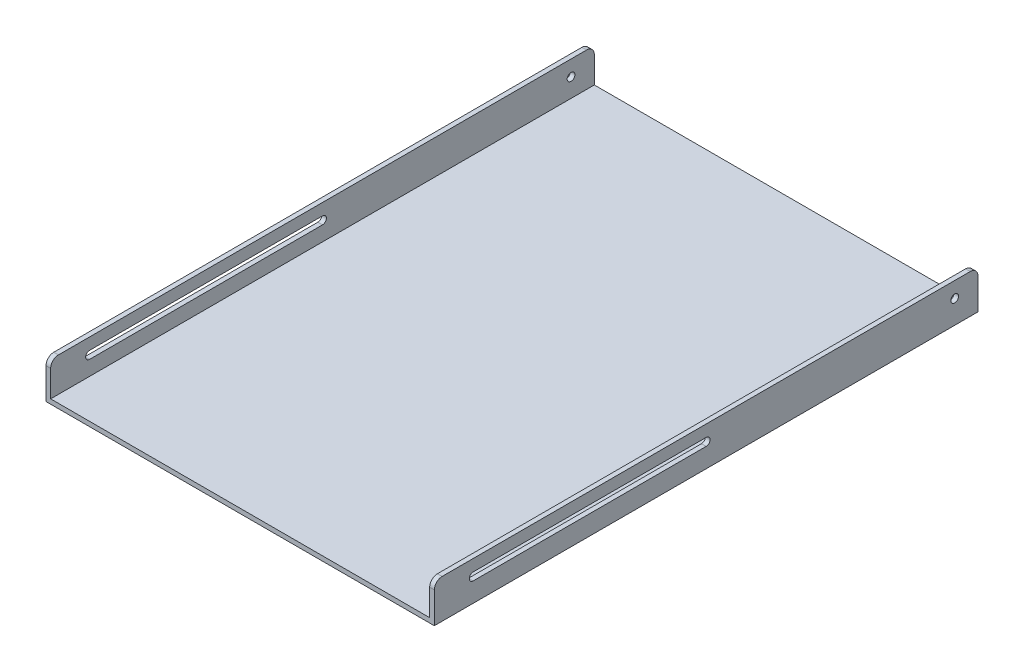
ISO-10303-21;
HEADER;
FILE_DESCRIPTION(('STEP AP214'),'2;1');
FILE_NAME('part.step','',(''),(''),'','','');
FILE_SCHEMA(('AUTOMOTIVE_DESIGN { 1 0 10303 214 1 1 1 1 }'));
ENDSEC;
DATA;
#1=APPLICATION_CONTEXT('core data for automotive mechanical design processes');
#2=APPLICATION_PROTOCOL_DEFINITION('international standard','automotive_design',2000,#1);
#3=PRODUCT_CONTEXT('',#1,'mechanical');
#4=PRODUCT('Part','Part','',(#3));
#5=PRODUCT_RELATED_PRODUCT_CATEGORY('part','',(#4));
#6=PRODUCT_DEFINITION_FORMATION('','',#4);
#7=PRODUCT_DEFINITION_CONTEXT('part definition',#1,'design');
#8=PRODUCT_DEFINITION('design','',#6,#7);
#9=PRODUCT_DEFINITION_SHAPE('','',#8);
#10=(LENGTH_UNIT() NAMED_UNIT(*) SI_UNIT(.MILLI.,.METRE.));
#11=(NAMED_UNIT(*) PLANE_ANGLE_UNIT() SI_UNIT($,.RADIAN.));
#12=(NAMED_UNIT(*) SI_UNIT($,.STERADIAN.) SOLID_ANGLE_UNIT());
#13=UNCERTAINTY_MEASURE_WITH_UNIT(LENGTH_MEASURE(1.E-05),#10,'distance_accuracy_value','');
#14=(GEOMETRIC_REPRESENTATION_CONTEXT(3) GLOBAL_UNCERTAINTY_ASSIGNED_CONTEXT((#13)) GLOBAL_UNIT_ASSIGNED_CONTEXT((#10,
#11,#12)) REPRESENTATION_CONTEXT('',''));
#15=CARTESIAN_POINT('',(0.,0.,0.));
#16=DIRECTION('',(0.,0.,1.));
#17=DIRECTION('',(1.,0.,0.));
#18=AXIS2_PLACEMENT_3D('',#15,#16,#17);
#19=CARTESIAN_POINT('',(-244.,0.,350.));
#20=DIRECTION('',(-1.,0.,0.));
#21=DIRECTION('',(0.,0.,1.));
#22=AXIS2_PLACEMENT_3D('',#19,#20,#21);
#23=PLANE('',#22);
#24=CARTESIAN_POINT('',(-244.,30.,-320.));
#25=DIRECTION('',(-1.,0.,0.));
#26=DIRECTION('',(0.,0.,1.));
#27=AXIS2_PLACEMENT_3D('',#24,#25,#26);
#28=CIRCLE('',#27,4.99999999999999);
#29=CARTESIAN_POINT('',(-244.,30.,-315.));
#30=VERTEX_POINT('',#29);
#31=EDGE_CURVE('E233',#30,#30,#28,.T.);
#32=ORIENTED_EDGE('',*,*,#31,.T.);
#33=EDGE_LOOP('',(#32));
#34=FACE_BOUND('',#33,.T.);
#35=DIRECTION('',(0.,0.,1.));
#36=VECTOR('',#35,1.);
#37=CARTESIAN_POINT('',(-244.,25.,350.));
#38=LINE('',#37,#36);
#39=CARTESIAN_POINT('',(-244.,25.,0.));
#40=VERTEX_POINT('',#39);
#41=CARTESIAN_POINT('',(-244.,25.,300.));
#42=VERTEX_POINT('',#41);
#43=EDGE_CURVE('E216',#40,#42,#38,.T.);
#44=ORIENTED_EDGE('',*,*,#43,.T.);
#45=CARTESIAN_POINT('',(-244.,30.,300.));
#46=DIRECTION('',(-1.,0.,0.));
#47=DIRECTION('',(0.,0.,1.));
#48=AXIS2_PLACEMENT_3D('',#45,#46,#47);
#49=CIRCLE('',#48,5.);
#50=CARTESIAN_POINT('',(-244.,35.,300.));
#51=VERTEX_POINT('',#50);
#52=EDGE_CURVE('E183',#42,#51,#49,.T.);
#53=ORIENTED_EDGE('',*,*,#52,.T.);
#54=DIRECTION('',(0.,0.,-1.));
#55=VECTOR('',#54,1.);
#56=CARTESIAN_POINT('',(-244.,35.,350.));
#57=LINE('',#56,#55);
#58=CARTESIAN_POINT('',(-244.,35.,0.));
#59=VERTEX_POINT('',#58);
#60=EDGE_CURVE('E224',#51,#59,#57,.T.);
#61=ORIENTED_EDGE('',*,*,#60,.T.);
#62=CARTESIAN_POINT('',(-244.,30.,0.));
#63=DIRECTION('',(-1.,0.,0.));
#64=DIRECTION('',(0.,0.,1.));
#65=AXIS2_PLACEMENT_3D('',#62,#63,#64);
#66=CIRCLE('',#65,5.);
#67=EDGE_CURVE('E220',#59,#40,#66,.T.);
#68=ORIENTED_EDGE('',*,*,#67,.T.);
#69=EDGE_LOOP('',(#44,#53,#61,#68));
#70=FACE_BOUND('',#69,.T.);
#71=DIRECTION('',(0.,0.,-1.));
#72=VECTOR('',#71,1.);
#73=CARTESIAN_POINT('',(-244.,50.,350.));
#74=LINE('',#73,#72);
#75=CARTESIAN_POINT('',(-244.,50.,340.));
#76=VERTEX_POINT('',#75);
#77=CARTESIAN_POINT('',(-244.,50.,-340.));
#78=VERTEX_POINT('',#77);
#79=EDGE_CURVE('E284',#76,#78,#74,.T.);
#80=ORIENTED_EDGE('',*,*,#79,.F.);
#81=CARTESIAN_POINT('',(-244.,40.,340.));
#82=DIRECTION('',(-1.,0.,0.));
#83=DIRECTION('',(0.,0.,1.));
#84=AXIS2_PLACEMENT_3D('',#81,#82,#83);
#85=CIRCLE('',#84,10.);
#86=CARTESIAN_POINT('',(-244.,40.,350.));
#87=VERTEX_POINT('',#86);
#88=EDGE_CURVE('E329',#76,#87,#85,.F.);
#89=ORIENTED_EDGE('',*,*,#88,.T.);
#90=DIRECTION('',(0.,1.,0.));
#91=VECTOR('',#90,1.);
#92=CARTESIAN_POINT('',(-244.,0.,350.));
#93=LINE('',#92,#91);
#94=CARTESIAN_POINT('',(-244.,6.,350.));
#95=VERTEX_POINT('',#94);
#96=EDGE_CURVE('E237',#95,#87,#93,.T.);
#97=ORIENTED_EDGE('',*,*,#96,.F.);
#98=DIRECTION('',(0.,0.,-1.));
#99=VECTOR('',#98,1.);
#100=CARTESIAN_POINT('',(-244.,6.,350.));
#101=LINE('',#100,#99);
#102=CARTESIAN_POINT('',(-244.,6.,-350.));
#103=VERTEX_POINT('',#102);
#104=EDGE_CURVE('E253',#95,#103,#101,.T.);
#105=ORIENTED_EDGE('',*,*,#104,.T.);
#106=DIRECTION('',(0.,1.,0.));
#107=VECTOR('',#106,1.);
#108=CARTESIAN_POINT('',(-244.,0.,-350.));
#109=LINE('',#108,#107);
#110=CARTESIAN_POINT('',(-244.,40.,-350.));
#111=VERTEX_POINT('',#110);
#112=EDGE_CURVE('E236',#103,#111,#109,.T.);
#113=ORIENTED_EDGE('',*,*,#112,.T.);
#114=CARTESIAN_POINT('',(-244.,40.,-340.));
#115=DIRECTION('',(-1.,0.,0.));
#116=DIRECTION('',(0.,0.,1.));
#117=AXIS2_PLACEMENT_3D('',#114,#115,#116);
#118=CIRCLE('',#117,10.);
#119=EDGE_CURVE('E58',#111,#78,#118,.F.);
#120=ORIENTED_EDGE('',*,*,#119,.T.);
#121=EDGE_LOOP('',(#80,#89,#97,#105,#113,#120));
#122=FACE_BOUND('',#121,.T.);
#123=ADVANCED_FACE('F35',(#34,#70,#122),#23,.F.);
#124=CARTESIAN_POINT('',(-250.,50.,350.));
#125=DIRECTION('',(0.,1.,0.));
#126=DIRECTION('',(0.,0.,1.));
#127=AXIS2_PLACEMENT_3D('',#124,#125,#126);
#128=PLANE('',#127);
#129=DIRECTION('',(0.,0.,-1.));
#130=VECTOR('',#129,1.);
#131=CARTESIAN_POINT('',(-250.,50.,350.));
#132=LINE('',#131,#130);
#133=CARTESIAN_POINT('',(-250.,50.,340.));
#134=VERTEX_POINT('',#133);
#135=CARTESIAN_POINT('',(-250.,50.,-340.));
#136=VERTEX_POINT('',#135);
#137=EDGE_CURVE('E282',#134,#136,#132,.T.);
#138=ORIENTED_EDGE('',*,*,#137,.F.);
#139=DIRECTION('',(1.,0.,0.));
#140=VECTOR('',#139,1.);
#141=CARTESIAN_POINT('',(-244.,50.,340.));
#142=LINE('',#141,#140);
#143=EDGE_CURVE('E325',#134,#76,#142,.T.);
#144=ORIENTED_EDGE('',*,*,#143,.T.);
#145=ORIENTED_EDGE('',*,*,#79,.T.);
#146=DIRECTION('',(1.,0.,0.));
#147=VECTOR('',#146,1.);
#148=CARTESIAN_POINT('',(-250.,50.,-340.));
#149=LINE('',#148,#147);
#150=EDGE_CURVE('E323',#78,#136,#149,.F.);
#151=ORIENTED_EDGE('',*,*,#150,.T.);
#152=EDGE_LOOP('',(#138,#144,#145,#151));
#153=FACE_BOUND('',#152,.T.);
#154=ADVANCED_FACE('F376',(#153),#128,.T.);
#155=CARTESIAN_POINT('',(-250.,0.,350.));
#156=DIRECTION('',(-1.,0.,0.));
#157=DIRECTION('',(0.,0.,1.));
#158=AXIS2_PLACEMENT_3D('',#155,#156,#157);
#159=PLANE('',#158);
#160=CARTESIAN_POINT('',(-250.,30.,-320.));
#161=DIRECTION('',(1.,0.,0.));
#162=DIRECTION('',(0.,0.,-1.));
#163=AXIS2_PLACEMENT_3D('',#160,#161,#162);
#164=CIRCLE('',#163,4.99999999999999);
#165=CARTESIAN_POINT('',(-250.,30.,-325.));
#166=VERTEX_POINT('',#165);
#167=EDGE_CURVE('E204',#166,#166,#164,.T.);
#168=ORIENTED_EDGE('',*,*,#167,.T.);
#169=EDGE_LOOP('',(#168));
#170=FACE_BOUND('',#169,.T.);
#171=CARTESIAN_POINT('',(-250.,30.,300.));
#172=DIRECTION('',(1.,0.,0.));
#173=DIRECTION('',(0.,0.,-1.));
#174=AXIS2_PLACEMENT_3D('',#171,#172,#173);
#175=CIRCLE('',#174,5.);
#176=CARTESIAN_POINT('',(-250.,35.,300.));
#177=VERTEX_POINT('',#176);
#178=CARTESIAN_POINT('',(-250.,25.,300.));
#179=VERTEX_POINT('',#178);
#180=EDGE_CURVE('E180',#177,#179,#175,.T.);
#181=ORIENTED_EDGE('',*,*,#180,.T.);
#182=DIRECTION('',(0.,0.,-1.));
#183=VECTOR('',#182,1.);
#184=CARTESIAN_POINT('',(-250.,25.,300.));
#185=LINE('',#184,#183);
#186=CARTESIAN_POINT('',(-250.,25.,0.));
#187=VERTEX_POINT('',#186);
#188=EDGE_CURVE('E191',#179,#187,#185,.T.);
#189=ORIENTED_EDGE('',*,*,#188,.T.);
#190=CARTESIAN_POINT('',(-250.,30.,0.));
#191=DIRECTION('',(1.,0.,0.));
#192=DIRECTION('',(0.,0.,-1.));
#193=AXIS2_PLACEMENT_3D('',#190,#191,#192);
#194=CIRCLE('',#193,5.);
#195=CARTESIAN_POINT('',(-250.,35.,0.));
#196=VERTEX_POINT('',#195);
#197=EDGE_CURVE('E197',#187,#196,#194,.T.);
#198=ORIENTED_EDGE('',*,*,#197,.T.);
#199=DIRECTION('',(0.,0.,1.));
#200=VECTOR('',#199,1.);
#201=CARTESIAN_POINT('',(-250.,35.,300.));
#202=LINE('',#201,#200);
#203=EDGE_CURVE('E201',#196,#177,#202,.T.);
#204=ORIENTED_EDGE('',*,*,#203,.T.);
#205=EDGE_LOOP('',(#181,#189,#198,#204));
#206=FACE_BOUND('',#205,.T.);
#207=DIRECTION('',(0.,1.,0.));
#208=VECTOR('',#207,1.);
#209=CARTESIAN_POINT('',(-250.,0.,350.));
#210=LINE('',#209,#208);
#211=CARTESIAN_POINT('',(-250.,0.,350.));
#212=VERTEX_POINT('',#211);
#213=CARTESIAN_POINT('',(-250.,40.,350.));
#214=VERTEX_POINT('',#213);
#215=EDGE_CURVE('E240',#212,#214,#210,.T.);
#216=ORIENTED_EDGE('',*,*,#215,.T.);
#217=CARTESIAN_POINT('',(-250.,40.,340.));
#218=DIRECTION('',(-1.,0.,0.));
#219=DIRECTION('',(0.,0.,1.));
#220=AXIS2_PLACEMENT_3D('',#217,#218,#219);
#221=CIRCLE('',#220,10.);
#222=EDGE_CURVE('E332',#214,#134,#221,.T.);
#223=ORIENTED_EDGE('',*,*,#222,.T.);
#224=ORIENTED_EDGE('',*,*,#137,.T.);
#225=CARTESIAN_POINT('',(-250.,40.,-340.));
#226=DIRECTION('',(-1.,0.,0.));
#227=DIRECTION('',(0.,0.,1.));
#228=AXIS2_PLACEMENT_3D('',#225,#226,#227);
#229=CIRCLE('',#228,10.);
#230=CARTESIAN_POINT('',(-250.,40.,-350.));
#231=VERTEX_POINT('',#230);
#232=EDGE_CURVE('E50',#136,#231,#229,.T.);
#233=ORIENTED_EDGE('',*,*,#232,.T.);
#234=DIRECTION('',(0.,1.,0.));
#235=VECTOR('',#234,1.);
#236=CARTESIAN_POINT('',(-250.,0.,-350.));
#237=LINE('',#236,#235);
#238=CARTESIAN_POINT('',(-250.,0.,-350.));
#239=VERTEX_POINT('',#238);
#240=EDGE_CURVE('E256',#239,#231,#237,.T.);
#241=ORIENTED_EDGE('',*,*,#240,.F.);
#242=DIRECTION('',(0.,0.,-1.));
#243=VECTOR('',#242,1.);
#244=CARTESIAN_POINT('',(-250.,0.,350.));
#245=LINE('',#244,#243);
#246=EDGE_CURVE('E280',#212,#239,#245,.T.);
#247=ORIENTED_EDGE('',*,*,#246,.F.);
#248=EDGE_LOOP('',(#216,#223,#224,#233,#241,#247));
#249=FACE_BOUND('',#248,.T.);
#250=ADVANCED_FACE('F199',(#170,#206,#249),#159,.T.);
#251=CARTESIAN_POINT('',(-250.,0.,350.));
#252=DIRECTION('',(0.,-1.,0.));
#253=DIRECTION('',(0.,0.,-1.));
#254=AXIS2_PLACEMENT_3D('',#251,#252,#253);
#255=PLANE('',#254);
#256=DIRECTION('',(-1.,0.,0.));
#257=VECTOR('',#256,1.);
#258=CARTESIAN_POINT('',(-250.,0.,-350.));
#259=LINE('',#258,#257);
#260=CARTESIAN_POINT('',(250.,0.,-350.));
#261=VERTEX_POINT('',#260);
#262=EDGE_CURVE('E258',#261,#239,#259,.T.);
#263=ORIENTED_EDGE('',*,*,#262,.F.);
#264=DIRECTION('',(0.,0.,-1.));
#265=VECTOR('',#264,1.);
#266=CARTESIAN_POINT('',(250.,0.,350.));
#267=LINE('',#266,#265);
#268=CARTESIAN_POINT('',(250.,0.,350.));
#269=VERTEX_POINT('',#268);
#270=EDGE_CURVE('E277',#269,#261,#267,.T.);
#271=ORIENTED_EDGE('',*,*,#270,.F.);
#272=DIRECTION('',(-1.,0.,0.));
#273=VECTOR('',#272,1.);
#274=CARTESIAN_POINT('',(-250.,0.,350.));
#275=LINE('',#274,#273);
#276=EDGE_CURVE('E244',#269,#212,#275,.T.);
#277=ORIENTED_EDGE('',*,*,#276,.T.);
#278=ORIENTED_EDGE('',*,*,#246,.T.);
#279=EDGE_LOOP('',(#263,#271,#277,#278));
#280=FACE_BOUND('',#279,.T.);
#281=ADVANCED_FACE('F373',(#280),#255,.T.);
#282=CARTESIAN_POINT('',(250.,0.,350.));
#283=DIRECTION('',(1.,0.,0.));
#284=DIRECTION('',(0.,0.,-1.));
#285=AXIS2_PLACEMENT_3D('',#282,#283,#284);
#286=PLANE('',#285);
#287=CARTESIAN_POINT('',(250.,30.,-320.));
#288=DIRECTION('',(1.,0.,0.));
#289=DIRECTION('',(0.,0.,-1.));
#290=AXIS2_PLACEMENT_3D('',#287,#288,#289);
#291=CIRCLE('',#290,4.99999999999999);
#292=CARTESIAN_POINT('',(250.,30.,-325.));
#293=VERTEX_POINT('',#292);
#294=EDGE_CURVE('E230',#293,#293,#291,.T.);
#295=ORIENTED_EDGE('',*,*,#294,.F.);
#296=EDGE_LOOP('',(#295));
#297=FACE_BOUND('',#296,.T.);
#298=CARTESIAN_POINT('',(250.,30.,300.));
#299=DIRECTION('',(1.,0.,0.));
#300=DIRECTION('',(0.,0.,-1.));
#301=AXIS2_PLACEMENT_3D('',#298,#299,#300);
#302=CIRCLE('',#301,5.);
#303=CARTESIAN_POINT('',(250.,35.,300.));
#304=VERTEX_POINT('',#303);
#305=CARTESIAN_POINT('',(250.,25.,300.));
#306=VERTEX_POINT('',#305);
#307=EDGE_CURVE('E227',#304,#306,#302,.T.);
#308=ORIENTED_EDGE('',*,*,#307,.F.);
#309=DIRECTION('',(0.,0.,1.));
#310=VECTOR('',#309,1.);
#311=CARTESIAN_POINT('',(250.,35.,300.));
#312=LINE('',#311,#310);
#313=CARTESIAN_POINT('',(250.,35.,0.));
#314=VERTEX_POINT('',#313);
#315=EDGE_CURVE('E223',#314,#304,#312,.T.);
#316=ORIENTED_EDGE('',*,*,#315,.F.);
#317=CARTESIAN_POINT('',(250.,30.,0.));
#318=DIRECTION('',(1.,0.,0.));
#319=DIRECTION('',(0.,0.,-1.));
#320=AXIS2_PLACEMENT_3D('',#317,#318,#319);
#321=CIRCLE('',#320,5.);
#322=CARTESIAN_POINT('',(250.,25.,0.));
#323=VERTEX_POINT('',#322);
#324=EDGE_CURVE('E218',#323,#314,#321,.T.);
#325=ORIENTED_EDGE('',*,*,#324,.F.);
#326=DIRECTION('',(0.,0.,-1.));
#327=VECTOR('',#326,1.);
#328=CARTESIAN_POINT('',(250.,25.,300.));
#329=LINE('',#328,#327);
#330=EDGE_CURVE('E219',#306,#323,#329,.T.);
#331=ORIENTED_EDGE('',*,*,#330,.F.);
#332=EDGE_LOOP('',(#308,#316,#325,#331));
#333=FACE_BOUND('',#332,.T.);
#334=DIRECTION('',(0.,0.,-1.));
#335=VECTOR('',#334,1.);
#336=CARTESIAN_POINT('',(250.,50.,350.));
#337=LINE('',#336,#335);
#338=CARTESIAN_POINT('',(250.,50.,340.));
#339=VERTEX_POINT('',#338);
#340=CARTESIAN_POINT('',(250.,50.,-340.));
#341=VERTEX_POINT('',#340);
#342=EDGE_CURVE('E274',#339,#341,#337,.T.);
#343=ORIENTED_EDGE('',*,*,#342,.F.);
#344=CARTESIAN_POINT('',(250.,40.,340.));
#345=DIRECTION('',(1.,0.,0.));
#346=DIRECTION('',(0.,0.,-1.));
#347=AXIS2_PLACEMENT_3D('',#344,#345,#346);
#348=CIRCLE('',#347,10.);
#349=CARTESIAN_POINT('',(250.,40.,350.));
#350=VERTEX_POINT('',#349);
#351=EDGE_CURVE('E313',#339,#350,#348,.T.);
#352=ORIENTED_EDGE('',*,*,#351,.T.);
#353=DIRECTION('',(0.,-1.,0.));
#354=VECTOR('',#353,1.);
#355=CARTESIAN_POINT('',(250.,0.,350.));
#356=LINE('',#355,#354);
#357=EDGE_CURVE('E247',#350,#269,#356,.T.);
#358=ORIENTED_EDGE('',*,*,#357,.T.);
#359=ORIENTED_EDGE('',*,*,#270,.T.);
#360=DIRECTION('',(0.,-1.,0.));
#361=VECTOR('',#360,1.);
#362=CARTESIAN_POINT('',(250.,0.,-350.));
#363=LINE('',#362,#361);
#364=CARTESIAN_POINT('',(250.,40.,-350.));
#365=VERTEX_POINT('',#364);
#366=EDGE_CURVE('E261',#365,#261,#363,.T.);
#367=ORIENTED_EDGE('',*,*,#366,.F.);
#368=CARTESIAN_POINT('',(250.,40.,-340.));
#369=DIRECTION('',(1.,0.,0.));
#370=DIRECTION('',(0.,0.,-1.));
#371=AXIS2_PLACEMENT_3D('',#368,#369,#370);
#372=CIRCLE('',#371,10.);
#373=EDGE_CURVE('E311',#365,#341,#372,.T.);
#374=ORIENTED_EDGE('',*,*,#373,.T.);
#375=EDGE_LOOP('',(#343,#352,#358,#359,#367,#374));
#376=FACE_BOUND('',#375,.T.);
#377=ADVANCED_FACE('F355',(#297,#333,#376),#286,.T.);
#378=CARTESIAN_POINT('',(244.,50.,350.));
#379=DIRECTION('',(0.,1.,0.));
#380=DIRECTION('',(0.,0.,1.));
#381=AXIS2_PLACEMENT_3D('',#378,#379,#380);
#382=PLANE('',#381);
#383=DIRECTION('',(0.,0.,-1.));
#384=VECTOR('',#383,1.);
#385=CARTESIAN_POINT('',(244.,50.,350.));
#386=LINE('',#385,#384);
#387=CARTESIAN_POINT('',(244.,50.,340.));
#388=VERTEX_POINT('',#387);
#389=CARTESIAN_POINT('',(244.,50.,-340.));
#390=VERTEX_POINT('',#389);
#391=EDGE_CURVE('E271',#388,#390,#386,.T.);
#392=ORIENTED_EDGE('',*,*,#391,.F.);
#393=DIRECTION('',(1.,0.,0.));
#394=VECTOR('',#393,1.);
#395=CARTESIAN_POINT('',(250.,50.,340.));
#396=LINE('',#395,#394);
#397=EDGE_CURVE('E308',#388,#339,#396,.T.);
#398=ORIENTED_EDGE('',*,*,#397,.T.);
#399=ORIENTED_EDGE('',*,*,#342,.T.);
#400=DIRECTION('',(1.,0.,0.));
#401=VECTOR('',#400,1.);
#402=CARTESIAN_POINT('',(244.,50.,-340.));
#403=LINE('',#402,#401);
#404=EDGE_CURVE('E299',#341,#390,#403,.F.);
#405=ORIENTED_EDGE('',*,*,#404,.T.);
#406=EDGE_LOOP('',(#392,#398,#399,#405));
#407=FACE_BOUND('',#406,.T.);
#408=ADVANCED_FACE('F358',(#407),#382,.T.);
#409=CARTESIAN_POINT('',(244.,0.,350.));
#410=DIRECTION('',(1.,0.,0.));
#411=DIRECTION('',(0.,0.,-1.));
#412=AXIS2_PLACEMENT_3D('',#409,#410,#411);
#413=PLANE('',#412);
#414=CARTESIAN_POINT('',(244.,30.,-320.));
#415=DIRECTION('',(1.,0.,0.));
#416=DIRECTION('',(0.,0.,-1.));
#417=AXIS2_PLACEMENT_3D('',#414,#415,#416);
#418=CIRCLE('',#417,4.99999999999999);
#419=CARTESIAN_POINT('',(244.,30.,-325.));
#420=VERTEX_POINT('',#419);
#421=EDGE_CURVE('E229',#420,#420,#418,.T.);
#422=ORIENTED_EDGE('',*,*,#421,.T.);
#423=EDGE_LOOP('',(#422));
#424=FACE_BOUND('',#423,.T.);
#425=DIRECTION('',(0.,0.,1.));
#426=VECTOR('',#425,1.);
#427=CARTESIAN_POINT('',(244.,35.,350.));
#428=LINE('',#427,#426);
#429=CARTESIAN_POINT('',(244.,35.,0.));
#430=VERTEX_POINT('',#429);
#431=CARTESIAN_POINT('',(244.,35.,300.));
#432=VERTEX_POINT('',#431);
#433=EDGE_CURVE('E293',#430,#432,#428,.T.);
#434=ORIENTED_EDGE('',*,*,#433,.T.);
#435=CARTESIAN_POINT('',(244.,30.,300.));
#436=DIRECTION('',(1.,0.,0.));
#437=DIRECTION('',(0.,0.,-1.));
#438=AXIS2_PLACEMENT_3D('',#435,#436,#437);
#439=CIRCLE('',#438,5.);
#440=CARTESIAN_POINT('',(244.,25.,300.));
#441=VERTEX_POINT('',#440);
#442=EDGE_CURVE('E296',#432,#441,#439,.T.);
#443=ORIENTED_EDGE('',*,*,#442,.T.);
#444=DIRECTION('',(0.,0.,-1.));
#445=VECTOR('',#444,1.);
#446=CARTESIAN_POINT('',(244.,25.,350.));
#447=LINE('',#446,#445);
#448=CARTESIAN_POINT('',(244.,25.,0.));
#449=VERTEX_POINT('',#448);
#450=EDGE_CURVE('E287',#441,#449,#447,.T.);
#451=ORIENTED_EDGE('',*,*,#450,.T.);
#452=CARTESIAN_POINT('',(244.,30.,0.));
#453=DIRECTION('',(1.,0.,0.));
#454=DIRECTION('',(0.,0.,-1.));
#455=AXIS2_PLACEMENT_3D('',#452,#453,#454);
#456=CIRCLE('',#455,5.);
#457=EDGE_CURVE('E290',#449,#430,#456,.T.);
#458=ORIENTED_EDGE('',*,*,#457,.T.);
#459=EDGE_LOOP('',(#434,#443,#451,#458));
#460=FACE_BOUND('',#459,.T.);
#461=DIRECTION('',(0.,1.,0.));
#462=VECTOR('',#461,1.);
#463=CARTESIAN_POINT('',(244.,0.,350.));
#464=LINE('',#463,#462);
#465=CARTESIAN_POINT('',(244.,40.,350.));
#466=VERTEX_POINT('',#465);
#467=CARTESIAN_POINT('',(244.,6.,350.));
#468=VERTEX_POINT('',#467);
#469=EDGE_CURVE('E249',#466,#468,#464,.F.);
#470=ORIENTED_EDGE('',*,*,#469,.F.);
#471=CARTESIAN_POINT('',(244.,40.,340.));
#472=DIRECTION('',(1.,0.,0.));
#473=DIRECTION('',(0.,0.,-1.));
#474=AXIS2_PLACEMENT_3D('',#471,#472,#473);
#475=CIRCLE('',#474,10.);
#476=EDGE_CURVE('E321',#466,#388,#475,.F.);
#477=ORIENTED_EDGE('',*,*,#476,.T.);
#478=ORIENTED_EDGE('',*,*,#391,.T.);
#479=CARTESIAN_POINT('',(244.,40.,-340.));
#480=DIRECTION('',(1.,0.,0.));
#481=DIRECTION('',(0.,0.,-1.));
#482=AXIS2_PLACEMENT_3D('',#479,#480,#481);
#483=CIRCLE('',#482,10.);
#484=CARTESIAN_POINT('',(244.,40.,-350.));
#485=VERTEX_POINT('',#484);
#486=EDGE_CURVE('E319',#390,#485,#483,.F.);
#487=ORIENTED_EDGE('',*,*,#486,.T.);
#488=DIRECTION('',(0.,1.,0.));
#489=VECTOR('',#488,1.);
#490=CARTESIAN_POINT('',(244.,0.,-350.));
#491=LINE('',#490,#489);
#492=CARTESIAN_POINT('',(244.,6.,-350.));
#493=VERTEX_POINT('',#492);
#494=EDGE_CURVE('E263',#485,#493,#491,.F.);
#495=ORIENTED_EDGE('',*,*,#494,.T.);
#496=DIRECTION('',(0.,0.,-1.));
#497=VECTOR('',#496,1.);
#498=CARTESIAN_POINT('',(244.,6.,350.));
#499=LINE('',#498,#497);
#500=EDGE_CURVE('E268',#468,#493,#499,.T.);
#501=ORIENTED_EDGE('',*,*,#500,.F.);
#502=EDGE_LOOP('',(#470,#477,#478,#487,#495,#501));
#503=FACE_BOUND('',#502,.T.);
#504=ADVANCED_FACE('F409',(#424,#460,#503),#413,.F.);
#505=CARTESIAN_POINT('',(-250.,6.,350.));
#506=DIRECTION('',(0.,-1.,0.));
#507=DIRECTION('',(0.,0.,-1.));
#508=AXIS2_PLACEMENT_3D('',#505,#506,#507);
#509=PLANE('',#508);
#510=DIRECTION('',(1.,0.,0.));
#511=VECTOR('',#510,1.);
#512=CARTESIAN_POINT('',(-250.,6.,-350.));
#513=LINE('',#512,#511);
#514=EDGE_CURVE('E241',#493,#103,#513,.F.);
#515=ORIENTED_EDGE('',*,*,#514,.T.);
#516=ORIENTED_EDGE('',*,*,#104,.F.);
#517=DIRECTION('',(1.,0.,0.));
#518=VECTOR('',#517,1.);
#519=CARTESIAN_POINT('',(-250.,6.,350.));
#520=LINE('',#519,#518);
#521=EDGE_CURVE('E251',#468,#95,#520,.F.);
#522=ORIENTED_EDGE('',*,*,#521,.F.);
#523=ORIENTED_EDGE('',*,*,#500,.T.);
#524=EDGE_LOOP('',(#515,#516,#522,#523));
#525=FACE_BOUND('',#524,.T.);
#526=ADVANCED_FACE('F344',(#525),#509,.F.);
#527=CARTESIAN_POINT('',(0.,0.,350.));
#528=DIRECTION('',(0.,0.,-1.));
#529=DIRECTION('',(-1.,0.,0.));
#530=AXIS2_PLACEMENT_3D('',#527,#528,#529);
#531=PLANE('',#530);
#532=ORIENTED_EDGE('',*,*,#357,.F.);
#533=DIRECTION('',(1.,0.,0.));
#534=VECTOR('',#533,1.);
#535=CARTESIAN_POINT('',(244.,40.,350.));
#536=LINE('',#535,#534);
#537=EDGE_CURVE('E317',#350,#466,#536,.F.);
#538=ORIENTED_EDGE('',*,*,#537,.T.);
#539=ORIENTED_EDGE('',*,*,#469,.T.);
#540=ORIENTED_EDGE('',*,*,#521,.T.);
#541=ORIENTED_EDGE('',*,*,#96,.T.);
#542=DIRECTION('',(1.,0.,0.));
#543=VECTOR('',#542,1.);
#544=CARTESIAN_POINT('',(-250.,40.,350.));
#545=LINE('',#544,#543);
#546=EDGE_CURVE('E315',#87,#214,#545,.F.);
#547=ORIENTED_EDGE('',*,*,#546,.T.);
#548=ORIENTED_EDGE('',*,*,#215,.F.);
#549=ORIENTED_EDGE('',*,*,#276,.F.);
#550=EDGE_LOOP('',(#532,#538,#539,#540,#541,#547,#548,#549));
#551=FACE_BOUND('',#550,.T.);
#552=ADVANCED_FACE('F368',(#551),#531,.F.);
#553=CARTESIAN_POINT('',(0.,0.,-350.));
#554=DIRECTION('',(0.,0.,-1.));
#555=DIRECTION('',(-1.,0.,0.));
#556=AXIS2_PLACEMENT_3D('',#553,#554,#555);
#557=PLANE('',#556);
#558=ORIENTED_EDGE('',*,*,#494,.F.);
#559=DIRECTION('',(1.,0.,0.));
#560=VECTOR('',#559,1.);
#561=CARTESIAN_POINT('',(0.,40.,-350.));
#562=LINE('',#561,#560);
#563=EDGE_CURVE('E11',#485,#365,#562,.T.);
#564=ORIENTED_EDGE('',*,*,#563,.T.);
#565=ORIENTED_EDGE('',*,*,#366,.T.);
#566=ORIENTED_EDGE('',*,*,#262,.T.);
#567=ORIENTED_EDGE('',*,*,#240,.T.);
#568=DIRECTION('',(1.,0.,0.));
#569=VECTOR('',#568,1.);
#570=CARTESIAN_POINT('',(0.,40.,-350.));
#571=LINE('',#570,#569);
#572=EDGE_CURVE('E43',#231,#111,#571,.T.);
#573=ORIENTED_EDGE('',*,*,#572,.T.);
#574=ORIENTED_EDGE('',*,*,#112,.F.);
#575=ORIENTED_EDGE('',*,*,#514,.F.);
#576=EDGE_LOOP('',(#558,#564,#565,#566,#567,#573,#574,#575));
#577=FACE_BOUND('',#576,.T.);
#578=ADVANCED_FACE('F336',(#577),#557,.T.);
#579=CARTESIAN_POINT('',(-250.,25.,300.));
#580=DIRECTION('',(0.,-1.,0.));
#581=DIRECTION('',(0.,0.,-1.));
#582=AXIS2_PLACEMENT_3D('',#579,#580,#581);
#583=PLANE('',#582);
#584=ORIENTED_EDGE('',*,*,#330,.T.);
#585=DIRECTION('',(1.,0.,0.));
#586=VECTOR('',#585,1.);
#587=CARTESIAN_POINT('',(-250.,25.,0.));
#588=LINE('',#587,#586);
#589=EDGE_CURVE('E186',#449,#323,#588,.T.);
#590=ORIENTED_EDGE('',*,*,#589,.F.);
#591=ORIENTED_EDGE('',*,*,#450,.F.);
#592=DIRECTION('',(1.,0.,0.));
#593=VECTOR('',#592,1.);
#594=CARTESIAN_POINT('',(-250.,25.,300.));
#595=LINE('',#594,#593);
#596=EDGE_CURVE('E187',#441,#306,#595,.T.);
#597=ORIENTED_EDGE('',*,*,#596,.T.);
#598=EDGE_LOOP('',(#584,#590,#591,#597));
#599=FACE_BOUND('',#598,.T.);
#600=ADVANCED_FACE('F446',(#599),#583,.F.);
#601=CARTESIAN_POINT('',(-250.,30.,0.));
#602=DIRECTION('',(1.,0.,0.));
#603=DIRECTION('',(0.,0.,-1.));
#604=AXIS2_PLACEMENT_3D('',#601,#602,#603);
#605=CYLINDRICAL_SURFACE('',#604,5.);
#606=ORIENTED_EDGE('',*,*,#324,.T.);
#607=DIRECTION('',(1.,0.,0.));
#608=VECTOR('',#607,1.);
#609=CARTESIAN_POINT('',(-250.,35.,0.));
#610=LINE('',#609,#608);
#611=EDGE_CURVE('E212',#430,#314,#610,.T.);
#612=ORIENTED_EDGE('',*,*,#611,.F.);
#613=ORIENTED_EDGE('',*,*,#457,.F.);
#614=ORIENTED_EDGE('',*,*,#589,.T.);
#615=EDGE_LOOP('',(#606,#612,#613,#614));
#616=FACE_BOUND('',#615,.T.);
#617=ADVANCED_FACE('F444',(#616),#605,.F.);
#618=CARTESIAN_POINT('',(-250.,35.,300.));
#619=DIRECTION('',(0.,1.,0.));
#620=DIRECTION('',(0.,0.,1.));
#621=AXIS2_PLACEMENT_3D('',#618,#619,#620);
#622=PLANE('',#621);
#623=ORIENTED_EDGE('',*,*,#315,.T.);
#624=DIRECTION('',(1.,0.,0.));
#625=VECTOR('',#624,1.);
#626=CARTESIAN_POINT('',(-250.,35.,300.));
#627=LINE('',#626,#625);
#628=EDGE_CURVE('E211',#432,#304,#627,.T.);
#629=ORIENTED_EDGE('',*,*,#628,.F.);
#630=ORIENTED_EDGE('',*,*,#433,.F.);
#631=ORIENTED_EDGE('',*,*,#611,.T.);
#632=EDGE_LOOP('',(#623,#629,#630,#631));
#633=FACE_BOUND('',#632,.T.);
#634=ADVANCED_FACE('F438',(#633),#622,.F.);
#635=CARTESIAN_POINT('',(-250.,30.,300.));
#636=DIRECTION('',(1.,0.,0.));
#637=DIRECTION('',(0.,0.,-1.));
#638=AXIS2_PLACEMENT_3D('',#635,#636,#637);
#639=CYLINDRICAL_SURFACE('',#638,5.);
#640=ORIENTED_EDGE('',*,*,#307,.T.);
#641=ORIENTED_EDGE('',*,*,#596,.F.);
#642=ORIENTED_EDGE('',*,*,#442,.F.);
#643=ORIENTED_EDGE('',*,*,#628,.T.);
#644=EDGE_LOOP('',(#640,#641,#642,#643));
#645=FACE_BOUND('',#644,.T.);
#646=ADVANCED_FACE('F435',(#645),#639,.F.);
#647=CARTESIAN_POINT('',(-250.,30.,-320.));
#648=DIRECTION('',(1.,0.,0.));
#649=DIRECTION('',(0.,0.,-1.));
#650=AXIS2_PLACEMENT_3D('',#647,#648,#649);
#651=CYLINDRICAL_SURFACE('',#650,4.99999999999999);
#652=ORIENTED_EDGE('',*,*,#294,.T.);
#653=EDGE_LOOP('',(#652));
#654=FACE_BOUND('',#653,.T.);
#655=ORIENTED_EDGE('',*,*,#421,.F.);
#656=EDGE_LOOP('',(#655));
#657=FACE_BOUND('',#656,.T.);
#658=ADVANCED_FACE('F463',(#654,#657),#651,.F.);
#659=EDGE_CURVE('E175',#179,#42,#595,.T.);
#660=ORIENTED_EDGE('',*,*,#659,.F.);
#661=ORIENTED_EDGE('',*,*,#180,.F.);
#662=EDGE_CURVE('E213',#177,#51,#627,.T.);
#663=ORIENTED_EDGE('',*,*,#662,.T.);
#664=ORIENTED_EDGE('',*,*,#52,.F.);
#665=EDGE_LOOP('',(#660,#661,#663,#664));
#666=FACE_BOUND('',#665,.T.);
#667=ADVANCED_FACE('F177',(#666),#639,.F.);
#668=ORIENTED_EDGE('',*,*,#662,.F.);
#669=ORIENTED_EDGE('',*,*,#203,.F.);
#670=EDGE_CURVE('E208',#196,#59,#610,.T.);
#671=ORIENTED_EDGE('',*,*,#670,.T.);
#672=ORIENTED_EDGE('',*,*,#60,.F.);
#673=EDGE_LOOP('',(#668,#669,#671,#672));
#674=FACE_BOUND('',#673,.T.);
#675=ADVANCED_FACE('F464',(#674),#622,.F.);
#676=ORIENTED_EDGE('',*,*,#670,.F.);
#677=ORIENTED_EDGE('',*,*,#197,.F.);
#678=EDGE_CURVE('E194',#187,#40,#588,.T.);
#679=ORIENTED_EDGE('',*,*,#678,.T.);
#680=ORIENTED_EDGE('',*,*,#67,.F.);
#681=EDGE_LOOP('',(#676,#677,#679,#680));
#682=FACE_BOUND('',#681,.T.);
#683=ADVANCED_FACE('F454',(#682),#605,.F.);
#684=ORIENTED_EDGE('',*,*,#678,.F.);
#685=ORIENTED_EDGE('',*,*,#188,.F.);
#686=ORIENTED_EDGE('',*,*,#659,.T.);
#687=ORIENTED_EDGE('',*,*,#43,.F.);
#688=EDGE_LOOP('',(#684,#685,#686,#687));
#689=FACE_BOUND('',#688,.T.);
#690=ADVANCED_FACE('F192',(#689),#583,.F.);
#691=ORIENTED_EDGE('',*,*,#167,.F.);
#692=EDGE_LOOP('',(#691));
#693=FACE_BOUND('',#692,.T.);
#694=ORIENTED_EDGE('',*,*,#31,.F.);
#695=EDGE_LOOP('',(#694));
#696=FACE_BOUND('',#695,.T.);
#697=ADVANCED_FACE('F397',(#693,#696),#651,.F.);
#698=CARTESIAN_POINT('',(244.,40.,340.));
#699=DIRECTION('',(-1.,0.,0.));
#700=DIRECTION('',(0.,0.,1.));
#701=AXIS2_PLACEMENT_3D('',#698,#699,#700);
#702=CYLINDRICAL_SURFACE('',#701,10.);
#703=ORIENTED_EDGE('',*,*,#476,.F.);
#704=ORIENTED_EDGE('',*,*,#537,.F.);
#705=ORIENTED_EDGE('',*,*,#351,.F.);
#706=ORIENTED_EDGE('',*,*,#397,.F.);
#707=EDGE_LOOP('',(#703,#704,#705,#706));
#708=FACE_BOUND('',#707,.T.);
#709=ADVANCED_FACE('F362',(#708),#702,.T.);
#710=CARTESIAN_POINT('',(-250.,40.,340.));
#711=DIRECTION('',(-1.,0.,0.));
#712=DIRECTION('',(0.,0.,1.));
#713=AXIS2_PLACEMENT_3D('',#710,#711,#712);
#714=CYLINDRICAL_SURFACE('',#713,10.);
#715=ORIENTED_EDGE('',*,*,#222,.F.);
#716=ORIENTED_EDGE('',*,*,#546,.F.);
#717=ORIENTED_EDGE('',*,*,#88,.F.);
#718=ORIENTED_EDGE('',*,*,#143,.F.);
#719=EDGE_LOOP('',(#715,#716,#717,#718));
#720=FACE_BOUND('',#719,.T.);
#721=ADVANCED_FACE('F396',(#720),#714,.T.);
#722=CARTESIAN_POINT('',(0.,40.,-340.));
#723=DIRECTION('',(1.,0.,0.));
#724=DIRECTION('',(0.,0.,-1.));
#725=AXIS2_PLACEMENT_3D('',#722,#723,#724);
#726=CYLINDRICAL_SURFACE('',#725,10.);
#727=ORIENTED_EDGE('',*,*,#486,.F.);
#728=ORIENTED_EDGE('',*,*,#404,.F.);
#729=ORIENTED_EDGE('',*,*,#373,.F.);
#730=ORIENTED_EDGE('',*,*,#563,.F.);
#731=EDGE_LOOP('',(#727,#728,#729,#730));
#732=FACE_BOUND('',#731,.T.);
#733=ADVANCED_FACE('F351',(#732),#726,.T.);
#734=CARTESIAN_POINT('',(0.,40.,-340.));
#735=DIRECTION('',(1.,0.,0.));
#736=DIRECTION('',(0.,0.,-1.));
#737=AXIS2_PLACEMENT_3D('',#734,#735,#736);
#738=CYLINDRICAL_SURFACE('',#737,10.);
#739=ORIENTED_EDGE('',*,*,#232,.F.);
#740=ORIENTED_EDGE('',*,*,#150,.F.);
#741=ORIENTED_EDGE('',*,*,#119,.F.);
#742=ORIENTED_EDGE('',*,*,#572,.F.);
#743=EDGE_LOOP('',(#739,#740,#741,#742));
#744=FACE_BOUND('',#743,.T.);
#745=ADVANCED_FACE('F37',(#744),#738,.T.);
#746=CLOSED_SHELL('',(#123,#154,#250,#281,#377,#408,#504,#526,#552,#578,#600,#617,#634,#646,
#658,#667,#675,#683,#690,#697,#709,#721,#733,#745));
#747=MANIFOLD_SOLID_BREP('B2',#746);
#748=ADVANCED_BREP_SHAPE_REPRESENTATION('',(#18,#747),#14);
#749=SHAPE_DEFINITION_REPRESENTATION(#9,#748);
ENDSEC;
END-ISO-10303-21;
